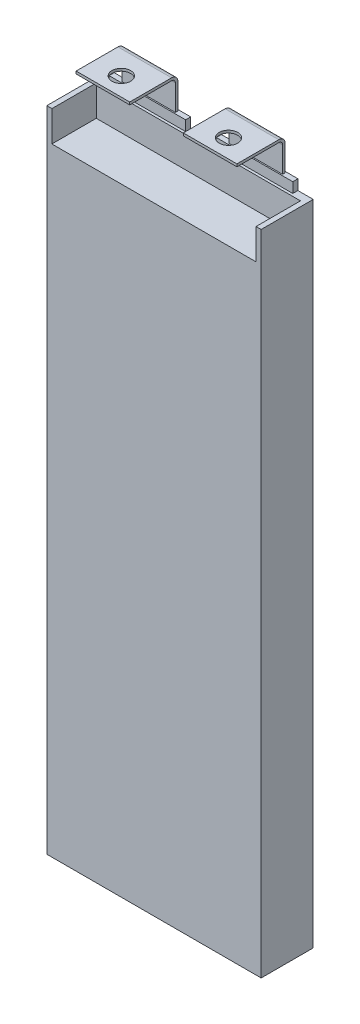
ISO-10303-21;
HEADER;
FILE_DESCRIPTION(('STEP AP214'),'2;1');
FILE_NAME('part.step','',(''),(''),'','','');
FILE_SCHEMA(('AUTOMOTIVE_DESIGN { 1 0 10303 214 1 1 1 1 }'));
ENDSEC;
DATA;
#1=APPLICATION_CONTEXT('core data for automotive mechanical design processes');
#2=APPLICATION_PROTOCOL_DEFINITION('international standard','automotive_design',2000,#1);
#3=PRODUCT_CONTEXT('',#1,'mechanical');
#4=PRODUCT('Part','Part','',(#3));
#5=PRODUCT_RELATED_PRODUCT_CATEGORY('part','',(#4));
#6=PRODUCT_DEFINITION_FORMATION('','',#4);
#7=PRODUCT_DEFINITION_CONTEXT('part definition',#1,'design');
#8=PRODUCT_DEFINITION('design','',#6,#7);
#9=PRODUCT_DEFINITION_SHAPE('','',#8);
#10=(LENGTH_UNIT() NAMED_UNIT(*) SI_UNIT(.MILLI.,.METRE.));
#11=(NAMED_UNIT(*) PLANE_ANGLE_UNIT() SI_UNIT($,.RADIAN.));
#12=(NAMED_UNIT(*) SI_UNIT($,.STERADIAN.) SOLID_ANGLE_UNIT());
#13=UNCERTAINTY_MEASURE_WITH_UNIT(LENGTH_MEASURE(1.E-05),#10,'distance_accuracy_value','');
#14=(GEOMETRIC_REPRESENTATION_CONTEXT(3) GLOBAL_UNCERTAINTY_ASSIGNED_CONTEXT((#13)) GLOBAL_UNIT_ASSIGNED_CONTEXT((#10,
#11,#12)) REPRESENTATION_CONTEXT('',''));
#15=CARTESIAN_POINT('',(0.,0.,0.));
#16=DIRECTION('',(0.,0.,1.));
#17=DIRECTION('',(1.,0.,0.));
#18=AXIS2_PLACEMENT_3D('',#15,#16,#17);
#19=CARTESIAN_POINT('',(-15.75,134.,-3.6));
#20=DIRECTION('',(1.,0.,0.));
#21=DIRECTION('',(0.,0.,-1.));
#22=AXIS2_PLACEMENT_3D('',#19,#20,#21);
#23=CYLINDRICAL_SURFACE('',#22,1.25);
#24=DIRECTION('',(1.,0.,0.));
#25=VECTOR('',#24,1.);
#26=CARTESIAN_POINT('',(-15.75,134.,-4.85));
#27=LINE('',#26,#25);
#28=CARTESIAN_POINT('',(-15.75,134.,-4.85));
#29=VERTEX_POINT('',#28);
#30=CARTESIAN_POINT('',(-5.25,134.,-4.85));
#31=VERTEX_POINT('',#30);
#32=EDGE_CURVE('E526',#29,#31,#27,.T.);
#33=ORIENTED_EDGE('',*,*,#32,.F.);
#34=CARTESIAN_POINT('',(-15.75,134.,-3.6));
#35=DIRECTION('',(-1.,0.,0.));
#36=DIRECTION('',(0.,0.,1.));
#37=AXIS2_PLACEMENT_3D('',#34,#35,#36);
#38=CIRCLE('',#37,1.25);
#39=CARTESIAN_POINT('',(-15.75,134.883883476483,-4.48388347648318));
#40=VERTEX_POINT('',#39);
#41=EDGE_CURVE('E532',#40,#29,#38,.T.);
#42=ORIENTED_EDGE('',*,*,#41,.F.);
#43=CARTESIAN_POINT('',(-15.75,134.,-3.6));
#44=DIRECTION('',(-1.,0.,0.));
#45=DIRECTION('',(0.,0.,1.));
#46=AXIS2_PLACEMENT_3D('',#43,#44,#45);
#47=CIRCLE('',#46,1.25);
#48=CARTESIAN_POINT('',(-15.75,135.25,-3.6));
#49=VERTEX_POINT('',#48);
#50=EDGE_CURVE('E61',#49,#40,#47,.T.);
#51=ORIENTED_EDGE('',*,*,#50,.F.);
#52=DIRECTION('',(1.,0.,0.));
#53=VECTOR('',#52,1.);
#54=CARTESIAN_POINT('',(-15.75,135.25,-3.6));
#55=LINE('',#54,#53);
#56=CARTESIAN_POINT('',(-5.25,135.25,-3.6));
#57=VERTEX_POINT('',#56);
#58=EDGE_CURVE('E529',#57,#49,#55,.F.);
#59=ORIENTED_EDGE('',*,*,#58,.F.);
#60=CARTESIAN_POINT('',(-5.25,134.,-3.6));
#61=DIRECTION('',(1.,0.,0.));
#62=DIRECTION('',(0.,0.,-1.));
#63=AXIS2_PLACEMENT_3D('',#60,#61,#62);
#64=CIRCLE('',#63,1.25);
#65=CARTESIAN_POINT('',(-5.25,134.883883476483,-4.48388347648318));
#66=VERTEX_POINT('',#65);
#67=EDGE_CURVE('E48',#66,#57,#64,.T.);
#68=ORIENTED_EDGE('',*,*,#67,.F.);
#69=CARTESIAN_POINT('',(-5.25,134.,-3.6));
#70=DIRECTION('',(1.,0.,0.));
#71=DIRECTION('',(0.,0.,-1.));
#72=AXIS2_PLACEMENT_3D('',#69,#70,#71);
#73=CIRCLE('',#72,1.25);
#74=EDGE_CURVE('E12',#31,#66,#73,.T.);
#75=ORIENTED_EDGE('',*,*,#74,.F.);
#76=EDGE_LOOP('',(#33,#42,#51,#59,#68,#75));
#77=FACE_BOUND('',#76,.T.);
#78=ADVANCED_FACE('F41',(#77),#23,.T.);
#79=CARTESIAN_POINT('',(-15.75,134.,-3.6));
#80=DIRECTION('',(1.,0.,0.));
#81=DIRECTION('',(0.,0.,-1.));
#82=AXIS2_PLACEMENT_3D('',#79,#80,#81);
#83=CYLINDRICAL_SURFACE('',#82,0.75);
#84=DIRECTION('',(-1.,0.,0.));
#85=VECTOR('',#84,1.);
#86=CARTESIAN_POINT('',(-15.75,134.,-4.35));
#87=LINE('',#86,#85);
#88=CARTESIAN_POINT('',(-5.25,134.,-4.35));
#89=VERTEX_POINT('',#88);
#90=CARTESIAN_POINT('',(-15.75,134.,-4.35));
#91=VERTEX_POINT('',#90);
#92=EDGE_CURVE('E516',#89,#91,#87,.T.);
#93=ORIENTED_EDGE('',*,*,#92,.F.);
#94=CARTESIAN_POINT('',(-5.25,134.,-3.6));
#95=DIRECTION('',(1.,0.,0.));
#96=DIRECTION('',(0.,0.,-1.));
#97=AXIS2_PLACEMENT_3D('',#94,#95,#96);
#98=CIRCLE('',#97,0.75);
#99=CARTESIAN_POINT('',(-5.25,134.75,-3.6));
#100=VERTEX_POINT('',#99);
#101=EDGE_CURVE('E522',#89,#100,#98,.T.);
#102=ORIENTED_EDGE('',*,*,#101,.T.);
#103=DIRECTION('',(-1.,0.,0.));
#104=VECTOR('',#103,1.);
#105=CARTESIAN_POINT('',(-15.75,134.75,-3.6));
#106=LINE('',#105,#104);
#107=CARTESIAN_POINT('',(-15.75,134.75,-3.6));
#108=VERTEX_POINT('',#107);
#109=EDGE_CURVE('E519',#108,#100,#106,.F.);
#110=ORIENTED_EDGE('',*,*,#109,.F.);
#111=CARTESIAN_POINT('',(-15.75,134.,-3.6));
#112=DIRECTION('',(-1.,0.,0.));
#113=DIRECTION('',(0.,0.,1.));
#114=AXIS2_PLACEMENT_3D('',#111,#112,#113);
#115=CIRCLE('',#114,0.75);
#116=EDGE_CURVE('E524',#108,#91,#115,.T.);
#117=ORIENTED_EDGE('',*,*,#116,.T.);
#118=EDGE_LOOP('',(#93,#102,#110,#117));
#119=FACE_BOUND('',#118,.T.);
#120=ADVANCED_FACE('F558',(#119),#83,.F.);
#121=CARTESIAN_POINT('',(5.25,134.,-3.6));
#122=DIRECTION('',(1.,0.,0.));
#123=DIRECTION('',(0.,0.,-1.));
#124=AXIS2_PLACEMENT_3D('',#121,#122,#123);
#125=CYLINDRICAL_SURFACE('',#124,1.25);
#126=DIRECTION('',(1.,0.,0.));
#127=VECTOR('',#126,1.);
#128=CARTESIAN_POINT('',(5.25,134.,-4.85));
#129=LINE('',#128,#127);
#130=CARTESIAN_POINT('',(5.25,134.,-4.85));
#131=VERTEX_POINT('',#130);
#132=CARTESIAN_POINT('',(15.75,134.,-4.85));
#133=VERTEX_POINT('',#132);
#134=EDGE_CURVE('E502',#131,#133,#129,.T.);
#135=ORIENTED_EDGE('',*,*,#134,.F.);
#136=CARTESIAN_POINT('',(5.25,134.,-3.6));
#137=DIRECTION('',(-1.,0.,0.));
#138=DIRECTION('',(0.,0.,1.));
#139=AXIS2_PLACEMENT_3D('',#136,#137,#138);
#140=CIRCLE('',#139,1.25);
#141=CARTESIAN_POINT('',(5.25,134.883883476483,-4.48388347648318));
#142=VERTEX_POINT('',#141);
#143=EDGE_CURVE('E508',#142,#131,#140,.T.);
#144=ORIENTED_EDGE('',*,*,#143,.F.);
#145=CARTESIAN_POINT('',(5.25,134.,-3.6));
#146=DIRECTION('',(-1.,0.,0.));
#147=DIRECTION('',(0.,0.,1.));
#148=AXIS2_PLACEMENT_3D('',#145,#146,#147);
#149=CIRCLE('',#148,1.25);
#150=CARTESIAN_POINT('',(5.25,135.25,-3.6));
#151=VERTEX_POINT('',#150);
#152=EDGE_CURVE('E510',#151,#142,#149,.T.);
#153=ORIENTED_EDGE('',*,*,#152,.F.);
#154=DIRECTION('',(1.,0.,0.));
#155=VECTOR('',#154,1.);
#156=CARTESIAN_POINT('',(5.25,135.25,-3.6));
#157=LINE('',#156,#155);
#158=CARTESIAN_POINT('',(15.75,135.25,-3.6));
#159=VERTEX_POINT('',#158);
#160=EDGE_CURVE('E505',#159,#151,#157,.F.);
#161=ORIENTED_EDGE('',*,*,#160,.F.);
#162=CARTESIAN_POINT('',(15.75,134.,-3.6));
#163=DIRECTION('',(1.,0.,0.));
#164=DIRECTION('',(0.,0.,-1.));
#165=AXIS2_PLACEMENT_3D('',#162,#163,#164);
#166=CIRCLE('',#165,1.25);
#167=CARTESIAN_POINT('',(15.75,134.883883476483,-4.48388347648319));
#168=VERTEX_POINT('',#167);
#169=EDGE_CURVE('E512',#168,#159,#166,.T.);
#170=ORIENTED_EDGE('',*,*,#169,.F.);
#171=CARTESIAN_POINT('',(15.75,134.,-3.6));
#172=DIRECTION('',(1.,0.,0.));
#173=DIRECTION('',(0.,0.,-1.));
#174=AXIS2_PLACEMENT_3D('',#171,#172,#173);
#175=CIRCLE('',#174,1.25);
#176=EDGE_CURVE('E514',#133,#168,#175,.T.);
#177=ORIENTED_EDGE('',*,*,#176,.F.);
#178=EDGE_LOOP('',(#135,#144,#153,#161,#170,#177));
#179=FACE_BOUND('',#178,.T.);
#180=ADVANCED_FACE('F587',(#179),#125,.T.);
#181=CARTESIAN_POINT('',(5.25,134.,-3.6));
#182=DIRECTION('',(1.,0.,0.));
#183=DIRECTION('',(0.,0.,-1.));
#184=AXIS2_PLACEMENT_3D('',#181,#182,#183);
#185=CYLINDRICAL_SURFACE('',#184,0.75);
#186=DIRECTION('',(-1.,0.,0.));
#187=VECTOR('',#186,1.);
#188=CARTESIAN_POINT('',(5.25,134.,-4.35));
#189=LINE('',#188,#187);
#190=CARTESIAN_POINT('',(15.75,134.,-4.35));
#191=VERTEX_POINT('',#190);
#192=CARTESIAN_POINT('',(5.25,134.,-4.35));
#193=VERTEX_POINT('',#192);
#194=EDGE_CURVE('E291',#191,#193,#189,.T.);
#195=ORIENTED_EDGE('',*,*,#194,.F.);
#196=CARTESIAN_POINT('',(15.75,134.,-3.6));
#197=DIRECTION('',(1.,0.,0.));
#198=DIRECTION('',(0.,0.,-1.));
#199=AXIS2_PLACEMENT_3D('',#196,#197,#198);
#200=CIRCLE('',#199,0.75);
#201=CARTESIAN_POINT('',(15.75,134.75,-3.6));
#202=VERTEX_POINT('',#201);
#203=EDGE_CURVE('E498',#191,#202,#200,.T.);
#204=ORIENTED_EDGE('',*,*,#203,.T.);
#205=DIRECTION('',(-1.,0.,0.));
#206=VECTOR('',#205,1.);
#207=CARTESIAN_POINT('',(5.25,134.75,-3.6));
#208=LINE('',#207,#206);
#209=CARTESIAN_POINT('',(5.25,134.75,-3.6));
#210=VERTEX_POINT('',#209);
#211=EDGE_CURVE('E495',#210,#202,#208,.F.);
#212=ORIENTED_EDGE('',*,*,#211,.F.);
#213=CARTESIAN_POINT('',(5.25,134.,-3.6));
#214=DIRECTION('',(-1.,0.,0.));
#215=DIRECTION('',(0.,0.,1.));
#216=AXIS2_PLACEMENT_3D('',#213,#214,#215);
#217=CIRCLE('',#216,0.75);
#218=EDGE_CURVE('E500',#210,#193,#217,.T.);
#219=ORIENTED_EDGE('',*,*,#218,.T.);
#220=EDGE_LOOP('',(#195,#204,#212,#219));
#221=FACE_BOUND('',#220,.T.);
#222=ADVANCED_FACE('F591',(#221),#185,.F.);
#223=CARTESIAN_POINT('',(-21.,127.,5.1));
#224=DIRECTION('',(0.,-1.,0.));
#225=DIRECTION('',(0.,0.,-1.));
#226=AXIS2_PLACEMENT_3D('',#223,#224,#225);
#227=PLANE('',#226);
#228=DIRECTION('',(0.,0.,1.));
#229=VECTOR('',#228,1.);
#230=CARTESIAN_POINT('',(-3.,127.,-5.1));
#231=LINE('',#230,#229);
#232=CARTESIAN_POINT('',(-3.00000000000001,127.,-5.1));
#233=VERTEX_POINT('',#232);
#234=CARTESIAN_POINT('',(-2.99999999999999,127.,-4.1));
#235=VERTEX_POINT('',#234);
#236=EDGE_CURVE('E334',#233,#235,#231,.T.);
#237=ORIENTED_EDGE('',*,*,#236,.T.);
#238=DIRECTION('',(-1.,0.,0.));
#239=VECTOR('',#238,1.);
#240=CARTESIAN_POINT('',(-3.,127.,-4.1));
#241=LINE('',#240,#239);
#242=CARTESIAN_POINT('',(-18.,127.,-4.1));
#243=VERTEX_POINT('',#242);
#244=EDGE_CURVE('E394',#235,#243,#241,.T.);
#245=ORIENTED_EDGE('',*,*,#244,.T.);
#246=DIRECTION('',(0.,0.,1.));
#247=VECTOR('',#246,1.);
#248=CARTESIAN_POINT('',(-18.,127.,-5.1));
#249=LINE('',#248,#247);
#250=CARTESIAN_POINT('',(-18.,127.,-5.1));
#251=VERTEX_POINT('',#250);
#252=EDGE_CURVE('E379',#251,#243,#249,.T.);
#253=ORIENTED_EDGE('',*,*,#252,.F.);
#254=DIRECTION('',(-1.,0.,0.));
#255=VECTOR('',#254,1.);
#256=CARTESIAN_POINT('',(-21.,127.,-5.1));
#257=LINE('',#256,#255);
#258=CARTESIAN_POINT('',(-21.,127.,-5.1));
#259=VERTEX_POINT('',#258);
#260=EDGE_CURVE('E479',#251,#259,#257,.T.);
#261=ORIENTED_EDGE('',*,*,#260,.T.);
#262=DIRECTION('',(0.,0.,-1.));
#263=VECTOR('',#262,1.);
#264=CARTESIAN_POINT('',(-21.,127.,5.1));
#265=LINE('',#264,#263);
#266=CARTESIAN_POINT('',(-21.,127.,5.1));
#267=VERTEX_POINT('',#266);
#268=EDGE_CURVE('E472',#267,#259,#265,.T.);
#269=ORIENTED_EDGE('',*,*,#268,.F.);
#270=DIRECTION('',(-1.,0.,0.));
#271=VECTOR('',#270,1.);
#272=CARTESIAN_POINT('',(-21.,127.,5.1));
#273=LINE('',#272,#271);
#274=CARTESIAN_POINT('',(-20.,127.,5.1));
#275=VERTEX_POINT('',#274);
#276=EDGE_CURVE('E468',#275,#267,#273,.T.);
#277=ORIENTED_EDGE('',*,*,#276,.F.);
#278=DIRECTION('',(0.,0.,1.));
#279=VECTOR('',#278,1.);
#280=CARTESIAN_POINT('',(-20.,127.,-45.0474968323134));
#281=LINE('',#280,#279);
#282=CARTESIAN_POINT('',(-20.,127.,-3.6));
#283=VERTEX_POINT('',#282);
#284=EDGE_CURVE('E446',#283,#275,#281,.T.);
#285=ORIENTED_EDGE('',*,*,#284,.F.);
#286=DIRECTION('',(-1.,0.,0.));
#287=VECTOR('',#286,1.);
#288=CARTESIAN_POINT('',(-20.,127.,-3.6));
#289=LINE('',#288,#287);
#290=CARTESIAN_POINT('',(20.,127.,-3.6));
#291=VERTEX_POINT('',#290);
#292=EDGE_CURVE('E447',#291,#283,#289,.T.);
#293=ORIENTED_EDGE('',*,*,#292,.F.);
#294=DIRECTION('',(0.,0.,1.));
#295=VECTOR('',#294,1.);
#296=CARTESIAN_POINT('',(20.,127.,-45.0474968323134));
#297=LINE('',#296,#295);
#298=CARTESIAN_POINT('',(20.,127.,5.1));
#299=VERTEX_POINT('',#298);
#300=EDGE_CURVE('E450',#291,#299,#297,.T.);
#301=ORIENTED_EDGE('',*,*,#300,.T.);
#302=CARTESIAN_POINT('',(21.,127.,5.1));
#303=VERTEX_POINT('',#302);
#304=EDGE_CURVE('E469',#303,#299,#273,.T.);
#305=ORIENTED_EDGE('',*,*,#304,.F.);
#306=DIRECTION('',(0.,0.,-1.));
#307=VECTOR('',#306,1.);
#308=CARTESIAN_POINT('',(21.,127.,5.1));
#309=LINE('',#308,#307);
#310=CARTESIAN_POINT('',(21.,127.,-5.1));
#311=VERTEX_POINT('',#310);
#312=EDGE_CURVE('E485',#303,#311,#309,.T.);
#313=ORIENTED_EDGE('',*,*,#312,.T.);
#314=CARTESIAN_POINT('',(18.,127.,-5.1));
#315=VERTEX_POINT('',#314);
#316=EDGE_CURVE('E464',#311,#315,#257,.T.);
#317=ORIENTED_EDGE('',*,*,#316,.T.);
#318=DIRECTION('',(0.,0.,1.));
#319=VECTOR('',#318,1.);
#320=CARTESIAN_POINT('',(18.,127.,-5.1));
#321=LINE('',#320,#319);
#322=CARTESIAN_POINT('',(18.,127.,-4.1));
#323=VERTEX_POINT('',#322);
#324=EDGE_CURVE('E427',#315,#323,#321,.T.);
#325=ORIENTED_EDGE('',*,*,#324,.T.);
#326=DIRECTION('',(-1.,0.,0.));
#327=VECTOR('',#326,1.);
#328=CARTESIAN_POINT('',(18.,127.,-4.1));
#329=LINE('',#328,#327);
#330=CARTESIAN_POINT('',(3.,127.,-4.1));
#331=VERTEX_POINT('',#330);
#332=EDGE_CURVE('E414',#323,#331,#329,.T.);
#333=ORIENTED_EDGE('',*,*,#332,.T.);
#334=DIRECTION('',(0.,0.,1.));
#335=VECTOR('',#334,1.);
#336=CARTESIAN_POINT('',(3.,127.,-5.1));
#337=LINE('',#336,#335);
#338=CARTESIAN_POINT('',(3.,127.,-5.1));
#339=VERTEX_POINT('',#338);
#340=EDGE_CURVE('E425',#339,#331,#337,.T.);
#341=ORIENTED_EDGE('',*,*,#340,.F.);
#342=EDGE_CURVE('E482',#339,#233,#257,.T.);
#343=ORIENTED_EDGE('',*,*,#342,.T.);
#344=EDGE_LOOP('',(#237,#245,#253,#261,#269,#277,#285,#293,#301,#305,#313,#317,#325,#333,#341,#343));
#345=FACE_BOUND('',#344,.T.);
#346=ADVANCED_FACE('F597',(#345),#227,.F.);
#347=CARTESIAN_POINT('',(-21.,0.,5.1));
#348=DIRECTION('',(1.,0.,0.));
#349=DIRECTION('',(0.,0.,-1.));
#350=AXIS2_PLACEMENT_3D('',#347,#348,#349);
#351=PLANE('',#350);
#352=DIRECTION('',(0.,-1.,0.));
#353=VECTOR('',#352,1.);
#354=CARTESIAN_POINT('',(-21.,0.,-5.1));
#355=LINE('',#354,#353);
#356=CARTESIAN_POINT('',(-21.,0.,-5.1));
#357=VERTEX_POINT('',#356);
#358=EDGE_CURVE('E459',#259,#357,#355,.T.);
#359=ORIENTED_EDGE('',*,*,#358,.T.);
#360=DIRECTION('',(0.,0.,-1.));
#361=VECTOR('',#360,1.);
#362=CARTESIAN_POINT('',(-21.,0.,5.1));
#363=LINE('',#362,#361);
#364=CARTESIAN_POINT('',(-21.,0.,5.1));
#365=VERTEX_POINT('',#364);
#366=EDGE_CURVE('E491',#365,#357,#363,.T.);
#367=ORIENTED_EDGE('',*,*,#366,.F.);
#368=DIRECTION('',(0.,-1.,0.));
#369=VECTOR('',#368,1.);
#370=CARTESIAN_POINT('',(-21.,0.,5.1));
#371=LINE('',#370,#369);
#372=EDGE_CURVE('E460',#267,#365,#371,.T.);
#373=ORIENTED_EDGE('',*,*,#372,.F.);
#374=ORIENTED_EDGE('',*,*,#268,.T.);
#375=EDGE_LOOP('',(#359,#367,#373,#374));
#376=FACE_BOUND('',#375,.T.);
#377=ADVANCED_FACE('F599',(#376),#351,.F.);
#378=CARTESIAN_POINT('',(-21.,0.,5.1));
#379=DIRECTION('',(0.,1.,0.));
#380=DIRECTION('',(0.,0.,1.));
#381=AXIS2_PLACEMENT_3D('',#378,#379,#380);
#382=PLANE('',#381);
#383=DIRECTION('',(1.,0.,0.));
#384=VECTOR('',#383,1.);
#385=CARTESIAN_POINT('',(-21.,0.,-5.1));
#386=LINE('',#385,#384);
#387=CARTESIAN_POINT('',(21.,0.,-5.1));
#388=VERTEX_POINT('',#387);
#389=EDGE_CURVE('E475',#357,#388,#386,.T.);
#390=ORIENTED_EDGE('',*,*,#389,.T.);
#391=DIRECTION('',(0.,0.,-1.));
#392=VECTOR('',#391,1.);
#393=CARTESIAN_POINT('',(21.,0.,5.1));
#394=LINE('',#393,#392);
#395=CARTESIAN_POINT('',(21.,0.,5.1));
#396=VERTEX_POINT('',#395);
#397=EDGE_CURVE('E488',#396,#388,#394,.T.);
#398=ORIENTED_EDGE('',*,*,#397,.F.);
#399=DIRECTION('',(1.,0.,0.));
#400=VECTOR('',#399,1.);
#401=CARTESIAN_POINT('',(-21.,0.,5.1));
#402=LINE('',#401,#400);
#403=EDGE_CURVE('E463',#365,#396,#402,.T.);
#404=ORIENTED_EDGE('',*,*,#403,.F.);
#405=ORIENTED_EDGE('',*,*,#366,.T.);
#406=EDGE_LOOP('',(#390,#398,#404,#405));
#407=FACE_BOUND('',#406,.T.);
#408=ADVANCED_FACE('F602',(#407),#382,.F.);
#409=CARTESIAN_POINT('',(21.,0.,5.1));
#410=DIRECTION('',(-1.,0.,0.));
#411=DIRECTION('',(0.,0.,1.));
#412=AXIS2_PLACEMENT_3D('',#409,#410,#411);
#413=PLANE('',#412);
#414=DIRECTION('',(0.,1.,0.));
#415=VECTOR('',#414,1.);
#416=CARTESIAN_POINT('',(21.,0.,-5.1));
#417=LINE('',#416,#415);
#418=EDGE_CURVE('E477',#388,#311,#417,.T.);
#419=ORIENTED_EDGE('',*,*,#418,.T.);
#420=ORIENTED_EDGE('',*,*,#312,.F.);
#421=DIRECTION('',(0.,1.,0.));
#422=VECTOR('',#421,1.);
#423=CARTESIAN_POINT('',(21.,0.,5.1));
#424=LINE('',#423,#422);
#425=EDGE_CURVE('E466',#396,#303,#424,.T.);
#426=ORIENTED_EDGE('',*,*,#425,.F.);
#427=ORIENTED_EDGE('',*,*,#397,.T.);
#428=EDGE_LOOP('',(#419,#420,#426,#427));
#429=FACE_BOUND('',#428,.T.);
#430=ADVANCED_FACE('F606',(#429),#413,.F.);
#431=CARTESIAN_POINT('',(0.,0.,5.1));
#432=DIRECTION('',(0.,0.,-1.));
#433=DIRECTION('',(-1.,0.,0.));
#434=AXIS2_PLACEMENT_3D('',#431,#432,#433);
#435=PLANE('',#434);
#436=ORIENTED_EDGE('',*,*,#304,.T.);
#437=DIRECTION('',(0.,1.,0.));
#438=VECTOR('',#437,1.);
#439=CARTESIAN_POINT('',(20.,127.,5.1));
#440=LINE('',#439,#438);
#441=CARTESIAN_POINT('',(20.,121.,5.1));
#442=VERTEX_POINT('',#441);
#443=EDGE_CURVE('E431',#442,#299,#440,.T.);
#444=ORIENTED_EDGE('',*,*,#443,.F.);
#445=DIRECTION('',(1.,0.,0.));
#446=VECTOR('',#445,1.);
#447=CARTESIAN_POINT('',(-20.,121.,5.1));
#448=LINE('',#447,#446);
#449=CARTESIAN_POINT('',(-20.,121.,5.1));
#450=VERTEX_POINT('',#449);
#451=EDGE_CURVE('E434',#450,#442,#448,.T.);
#452=ORIENTED_EDGE('',*,*,#451,.F.);
#453=DIRECTION('',(0.,-1.,0.));
#454=VECTOR('',#453,1.);
#455=CARTESIAN_POINT('',(-20.,127.,5.1));
#456=LINE('',#455,#454);
#457=EDGE_CURVE('E430',#275,#450,#456,.T.);
#458=ORIENTED_EDGE('',*,*,#457,.F.);
#459=ORIENTED_EDGE('',*,*,#276,.T.);
#460=ORIENTED_EDGE('',*,*,#372,.T.);
#461=ORIENTED_EDGE('',*,*,#403,.T.);
#462=ORIENTED_EDGE('',*,*,#425,.T.);
#463=EDGE_LOOP('',(#436,#444,#452,#458,#459,#460,#461,#462));
#464=FACE_BOUND('',#463,.T.);
#465=ADVANCED_FACE('F610',(#464),#435,.F.);
#466=CARTESIAN_POINT('',(0.,0.,-5.1));
#467=DIRECTION('',(0.,0.,-1.));
#468=DIRECTION('',(-1.,0.,0.));
#469=AXIS2_PLACEMENT_3D('',#466,#467,#468);
#470=PLANE('',#469);
#471=ORIENTED_EDGE('',*,*,#358,.F.);
#472=ORIENTED_EDGE('',*,*,#260,.F.);
#473=DIRECTION('',(0.,1.,0.));
#474=VECTOR('',#473,1.);
#475=CARTESIAN_POINT('',(-18.,127.,-5.1));
#476=LINE('',#475,#474);
#477=CARTESIAN_POINT('',(-18.,129.,-5.1));
#478=VERTEX_POINT('',#477);
#479=EDGE_CURVE('E401',#251,#478,#476,.T.);
#480=ORIENTED_EDGE('',*,*,#479,.T.);
#481=DIRECTION('',(1.,0.,0.));
#482=VECTOR('',#481,1.);
#483=CARTESIAN_POINT('',(-2.99999999999999,129.,-5.1));
#484=LINE('',#483,#482);
#485=CARTESIAN_POINT('',(-2.99999999999999,129.,-5.1));
#486=VERTEX_POINT('',#485);
#487=EDGE_CURVE('E388',#478,#486,#484,.T.);
#488=ORIENTED_EDGE('',*,*,#487,.T.);
#489=DIRECTION('',(0.,-1.,0.));
#490=VECTOR('',#489,1.);
#491=CARTESIAN_POINT('',(-3.,127.,-5.1));
#492=LINE('',#491,#490);
#493=EDGE_CURVE('E392',#486,#233,#492,.T.);
#494=ORIENTED_EDGE('',*,*,#493,.T.);
#495=ORIENTED_EDGE('',*,*,#342,.F.);
#496=DIRECTION('',(0.,1.,0.));
#497=VECTOR('',#496,1.);
#498=CARTESIAN_POINT('',(3.,127.,-5.1));
#499=LINE('',#498,#497);
#500=CARTESIAN_POINT('',(2.99999999999999,129.,-5.1));
#501=VERTEX_POINT('',#500);
#502=EDGE_CURVE('E407',#339,#501,#499,.T.);
#503=ORIENTED_EDGE('',*,*,#502,.T.);
#504=DIRECTION('',(1.,0.,0.));
#505=VECTOR('',#504,1.);
#506=CARTESIAN_POINT('',(18.,129.,-5.1));
#507=LINE('',#506,#505);
#508=CARTESIAN_POINT('',(18.,129.,-5.1));
#509=VERTEX_POINT('',#508);
#510=EDGE_CURVE('E410',#501,#509,#507,.T.);
#511=ORIENTED_EDGE('',*,*,#510,.T.);
#512=DIRECTION('',(0.,-1.,0.));
#513=VECTOR('',#512,1.);
#514=CARTESIAN_POINT('',(18.,127.,-5.1));
#515=LINE('',#514,#513);
#516=EDGE_CURVE('E405',#509,#315,#515,.T.);
#517=ORIENTED_EDGE('',*,*,#516,.T.);
#518=ORIENTED_EDGE('',*,*,#316,.F.);
#519=ORIENTED_EDGE('',*,*,#418,.F.);
#520=ORIENTED_EDGE('',*,*,#389,.F.);
#521=EDGE_LOOP('',(#471,#472,#480,#488,#494,#495,#503,#511,#517,#518,#519,#520));
#522=FACE_BOUND('',#521,.T.);
#523=ADVANCED_FACE('F615',(#522),#470,.T.);
#524=CARTESIAN_POINT('',(0.,0.,-3.6));
#525=DIRECTION('',(0.,0.,-1.));
#526=DIRECTION('',(-1.,0.,0.));
#527=AXIS2_PLACEMENT_3D('',#524,#525,#526);
#528=PLANE('',#527);
#529=DIRECTION('',(0.,-1.,0.));
#530=VECTOR('',#529,1.);
#531=CARTESIAN_POINT('',(-20.,127.,-3.6));
#532=LINE('',#531,#530);
#533=CARTESIAN_POINT('',(-20.,121.,-3.6));
#534=VERTEX_POINT('',#533);
#535=EDGE_CURVE('E442',#283,#534,#532,.T.);
#536=ORIENTED_EDGE('',*,*,#535,.T.);
#537=DIRECTION('',(1.,0.,0.));
#538=VECTOR('',#537,1.);
#539=CARTESIAN_POINT('',(-20.,121.,-3.6));
#540=LINE('',#539,#538);
#541=CARTESIAN_POINT('',(20.,121.,-3.6));
#542=VERTEX_POINT('',#541);
#543=EDGE_CURVE('E433',#534,#542,#540,.T.);
#544=ORIENTED_EDGE('',*,*,#543,.T.);
#545=DIRECTION('',(0.,1.,0.));
#546=VECTOR('',#545,1.);
#547=CARTESIAN_POINT('',(20.,127.,-3.6));
#548=LINE('',#547,#546);
#549=EDGE_CURVE('E451',#542,#291,#548,.T.);
#550=ORIENTED_EDGE('',*,*,#549,.T.);
#551=ORIENTED_EDGE('',*,*,#292,.T.);
#552=EDGE_LOOP('',(#536,#544,#550,#551));
#553=FACE_BOUND('',#552,.T.);
#554=ADVANCED_FACE('F618',(#553),#528,.F.);
#555=CARTESIAN_POINT('',(-20.,121.,-45.0474968323134));
#556=DIRECTION('',(0.,-1.,0.));
#557=DIRECTION('',(0.,0.,-1.));
#558=AXIS2_PLACEMENT_3D('',#555,#556,#557);
#559=PLANE('',#558);
#560=DIRECTION('',(0.,0.,1.));
#561=VECTOR('',#560,1.);
#562=CARTESIAN_POINT('',(-20.,121.,-45.0474968323134));
#563=LINE('',#562,#561);
#564=EDGE_CURVE('E445',#534,#450,#563,.T.);
#565=ORIENTED_EDGE('',*,*,#564,.T.);
#566=ORIENTED_EDGE('',*,*,#451,.T.);
#567=DIRECTION('',(0.,0.,1.));
#568=VECTOR('',#567,1.);
#569=CARTESIAN_POINT('',(20.,121.,-45.0474968323134));
#570=LINE('',#569,#568);
#571=EDGE_CURVE('E441',#542,#442,#570,.T.);
#572=ORIENTED_EDGE('',*,*,#571,.F.);
#573=ORIENTED_EDGE('',*,*,#543,.F.);
#574=EDGE_LOOP('',(#565,#566,#572,#573));
#575=FACE_BOUND('',#574,.T.);
#576=ADVANCED_FACE('F625',(#575),#559,.F.);
#577=CARTESIAN_POINT('',(20.,127.,-45.0474968323134));
#578=DIRECTION('',(1.,0.,0.));
#579=DIRECTION('',(0.,0.,-1.));
#580=AXIS2_PLACEMENT_3D('',#577,#578,#579);
#581=PLANE('',#580);
#582=ORIENTED_EDGE('',*,*,#571,.T.);
#583=ORIENTED_EDGE('',*,*,#443,.T.);
#584=ORIENTED_EDGE('',*,*,#300,.F.);
#585=ORIENTED_EDGE('',*,*,#549,.F.);
#586=EDGE_LOOP('',(#582,#583,#584,#585));
#587=FACE_BOUND('',#586,.T.);
#588=ADVANCED_FACE('F629',(#587),#581,.F.);
#589=CARTESIAN_POINT('',(-20.,127.,-45.0474968323134));
#590=DIRECTION('',(-1.,0.,0.));
#591=DIRECTION('',(0.,-1.,0.));
#592=AXIS2_PLACEMENT_3D('',#589,#590,#591);
#593=PLANE('',#592);
#594=ORIENTED_EDGE('',*,*,#284,.T.);
#595=ORIENTED_EDGE('',*,*,#457,.T.);
#596=ORIENTED_EDGE('',*,*,#564,.F.);
#597=ORIENTED_EDGE('',*,*,#535,.F.);
#598=EDGE_LOOP('',(#594,#595,#596,#597));
#599=FACE_BOUND('',#598,.T.);
#600=ADVANCED_FACE('F633',(#599),#593,.F.);
#601=CARTESIAN_POINT('',(18.,127.,-5.1));
#602=DIRECTION('',(-1.,0.,0.));
#603=DIRECTION('',(0.,-1.,0.));
#604=AXIS2_PLACEMENT_3D('',#601,#602,#603);
#605=PLANE('',#604);
#606=DIRECTION('',(0.,-1.,0.));
#607=VECTOR('',#606,1.);
#608=CARTESIAN_POINT('',(18.,127.,-4.1));
#609=LINE('',#608,#607);
#610=CARTESIAN_POINT('',(18.,129.,-4.1));
#611=VERTEX_POINT('',#610);
#612=EDGE_CURVE('E399',#611,#323,#609,.T.);
#613=ORIENTED_EDGE('',*,*,#612,.T.);
#614=ORIENTED_EDGE('',*,*,#324,.F.);
#615=ORIENTED_EDGE('',*,*,#516,.F.);
#616=DIRECTION('',(0.,0.,1.));
#617=VECTOR('',#616,1.);
#618=CARTESIAN_POINT('',(18.,129.,-5.1));
#619=LINE('',#618,#617);
#620=EDGE_CURVE('E412',#509,#611,#619,.T.);
#621=ORIENTED_EDGE('',*,*,#620,.T.);
#622=EDGE_LOOP('',(#613,#614,#615,#621));
#623=FACE_BOUND('',#622,.T.);
#624=ADVANCED_FACE('F637',(#623),#605,.F.);
#625=CARTESIAN_POINT('',(3.,127.,-5.1));
#626=DIRECTION('',(1.,0.,0.));
#627=DIRECTION('',(0.,1.,0.));
#628=AXIS2_PLACEMENT_3D('',#625,#626,#627);
#629=PLANE('',#628);
#630=DIRECTION('',(0.,1.,0.));
#631=VECTOR('',#630,1.);
#632=CARTESIAN_POINT('',(3.,127.,-4.1));
#633=LINE('',#632,#631);
#634=CARTESIAN_POINT('',(2.99999999999999,129.,-4.1));
#635=VERTEX_POINT('',#634);
#636=EDGE_CURVE('E417',#331,#635,#633,.T.);
#637=ORIENTED_EDGE('',*,*,#636,.T.);
#638=DIRECTION('',(0.,0.,1.));
#639=VECTOR('',#638,1.);
#640=CARTESIAN_POINT('',(2.99999999999999,129.,-5.1));
#641=LINE('',#640,#639);
#642=EDGE_CURVE('E422',#501,#635,#641,.T.);
#643=ORIENTED_EDGE('',*,*,#642,.F.);
#644=ORIENTED_EDGE('',*,*,#502,.F.);
#645=ORIENTED_EDGE('',*,*,#340,.T.);
#646=EDGE_LOOP('',(#637,#643,#644,#645));
#647=FACE_BOUND('',#646,.T.);
#648=ADVANCED_FACE('F641',(#647),#629,.F.);
#649=CARTESIAN_POINT('',(18.,129.,-5.1));
#650=DIRECTION('',(0.,-1.,0.));
#651=DIRECTION('',(0.,0.,-1.));
#652=AXIS2_PLACEMENT_3D('',#649,#650,#651);
#653=PLANE('',#652);
#654=DIRECTION('',(0.,0.,1.));
#655=VECTOR('',#654,1.);
#656=CARTESIAN_POINT('',(5.25,129.,-4.85));
#657=LINE('',#656,#655);
#658=CARTESIAN_POINT('',(5.25,129.,-4.85));
#659=VERTEX_POINT('',#658);
#660=CARTESIAN_POINT('',(5.25,129.,-4.35));
#661=VERTEX_POINT('',#660);
#662=EDGE_CURVE('E271',#659,#661,#657,.T.);
#663=ORIENTED_EDGE('',*,*,#662,.F.);
#664=DIRECTION('',(-1.,0.,0.));
#665=VECTOR('',#664,1.);
#666=CARTESIAN_POINT('',(5.25,129.,-4.85));
#667=LINE('',#666,#665);
#668=CARTESIAN_POINT('',(15.75,129.,-4.85));
#669=VERTEX_POINT('',#668);
#670=EDGE_CURVE('E299',#669,#659,#667,.T.);
#671=ORIENTED_EDGE('',*,*,#670,.F.);
#672=DIRECTION('',(0.,0.,-1.));
#673=VECTOR('',#672,1.);
#674=CARTESIAN_POINT('',(15.75,129.,-4.85));
#675=LINE('',#674,#673);
#676=CARTESIAN_POINT('',(15.75,129.,-4.35));
#677=VERTEX_POINT('',#676);
#678=EDGE_CURVE('E297',#677,#669,#675,.T.);
#679=ORIENTED_EDGE('',*,*,#678,.F.);
#680=DIRECTION('',(1.,0.,0.));
#681=VECTOR('',#680,1.);
#682=CARTESIAN_POINT('',(5.25,129.,-4.35));
#683=LINE('',#682,#681);
#684=EDGE_CURVE('E282',#661,#677,#683,.T.);
#685=ORIENTED_EDGE('',*,*,#684,.F.);
#686=EDGE_LOOP('',(#663,#671,#679,#685));
#687=FACE_BOUND('',#686,.T.);
#688=DIRECTION('',(1.,0.,0.));
#689=VECTOR('',#688,1.);
#690=CARTESIAN_POINT('',(18.,129.,-4.1));
#691=LINE('',#690,#689);
#692=EDGE_CURVE('E408',#635,#611,#691,.T.);
#693=ORIENTED_EDGE('',*,*,#692,.T.);
#694=ORIENTED_EDGE('',*,*,#620,.F.);
#695=ORIENTED_EDGE('',*,*,#510,.F.);
#696=ORIENTED_EDGE('',*,*,#642,.T.);
#697=EDGE_LOOP('',(#693,#694,#695,#696));
#698=FACE_BOUND('',#697,.T.);
#699=ADVANCED_FACE('F295',(#687,#698),#653,.F.);
#700=CARTESIAN_POINT('',(0.,0.,-4.1));
#701=DIRECTION('',(0.,0.,1.));
#702=DIRECTION('',(1.,0.,0.));
#703=AXIS2_PLACEMENT_3D('',#700,#701,#702);
#704=PLANE('',#703);
#705=ORIENTED_EDGE('',*,*,#612,.F.);
#706=ORIENTED_EDGE('',*,*,#692,.F.);
#707=ORIENTED_EDGE('',*,*,#636,.F.);
#708=ORIENTED_EDGE('',*,*,#332,.F.);
#709=EDGE_LOOP('',(#705,#706,#707,#708));
#710=FACE_BOUND('',#709,.T.);
#711=ADVANCED_FACE('F648',(#710),#704,.T.);
#712=CARTESIAN_POINT('',(-3.,127.,-5.1));
#713=DIRECTION('',(-1.,0.,0.));
#714=DIRECTION('',(0.,-1.,0.));
#715=AXIS2_PLACEMENT_3D('',#712,#713,#714);
#716=PLANE('',#715);
#717=DIRECTION('',(0.,-1.,0.));
#718=VECTOR('',#717,1.);
#719=CARTESIAN_POINT('',(-3.,127.,-4.1));
#720=LINE('',#719,#718);
#721=CARTESIAN_POINT('',(-2.99999999999999,129.,-4.1));
#722=VERTEX_POINT('',#721);
#723=EDGE_CURVE('E396',#722,#235,#720,.T.);
#724=ORIENTED_EDGE('',*,*,#723,.T.);
#725=ORIENTED_EDGE('',*,*,#236,.F.);
#726=ORIENTED_EDGE('',*,*,#493,.F.);
#727=DIRECTION('',(0.,0.,1.));
#728=VECTOR('',#727,1.);
#729=CARTESIAN_POINT('',(-2.99999999999999,129.,-5.1));
#730=LINE('',#729,#728);
#731=EDGE_CURVE('E385',#486,#722,#730,.T.);
#732=ORIENTED_EDGE('',*,*,#731,.T.);
#733=EDGE_LOOP('',(#724,#725,#726,#732));
#734=FACE_BOUND('',#733,.T.);
#735=ADVANCED_FACE('F651',(#734),#716,.F.);
#736=CARTESIAN_POINT('',(-18.,127.,-5.1));
#737=DIRECTION('',(1.,0.,0.));
#738=DIRECTION('',(0.,1.,0.));
#739=AXIS2_PLACEMENT_3D('',#736,#737,#738);
#740=PLANE('',#739);
#741=DIRECTION('',(0.,1.,0.));
#742=VECTOR('',#741,1.);
#743=CARTESIAN_POINT('',(-18.,127.,-4.1));
#744=LINE('',#743,#742);
#745=CARTESIAN_POINT('',(-18.,129.,-4.1));
#746=VERTEX_POINT('',#745);
#747=EDGE_CURVE('E391',#243,#746,#744,.T.);
#748=ORIENTED_EDGE('',*,*,#747,.T.);
#749=DIRECTION('',(0.,0.,1.));
#750=VECTOR('',#749,1.);
#751=CARTESIAN_POINT('',(-18.,129.,-5.1));
#752=LINE('',#751,#750);
#753=EDGE_CURVE('E382',#478,#746,#752,.T.);
#754=ORIENTED_EDGE('',*,*,#753,.F.);
#755=ORIENTED_EDGE('',*,*,#479,.F.);
#756=ORIENTED_EDGE('',*,*,#252,.T.);
#757=EDGE_LOOP('',(#748,#754,#755,#756));
#758=FACE_BOUND('',#757,.T.);
#759=ADVANCED_FACE('F658',(#758),#740,.F.);
#760=CARTESIAN_POINT('',(-2.99999999999999,129.,-5.1));
#761=DIRECTION('',(0.,-1.,0.));
#762=DIRECTION('',(0.,0.,-1.));
#763=AXIS2_PLACEMENT_3D('',#760,#761,#762);
#764=PLANE('',#763);
#765=DIRECTION('',(0.,0.,1.));
#766=VECTOR('',#765,1.);
#767=CARTESIAN_POINT('',(-15.75,129.,-4.85));
#768=LINE('',#767,#766);
#769=CARTESIAN_POINT('',(-15.75,129.,-4.85));
#770=VERTEX_POINT('',#769);
#771=CARTESIAN_POINT('',(-15.75,129.,-4.35));
#772=VERTEX_POINT('',#771);
#773=EDGE_CURVE('E336',#770,#772,#768,.T.);
#774=ORIENTED_EDGE('',*,*,#773,.F.);
#775=DIRECTION('',(-1.,0.,0.));
#776=VECTOR('',#775,1.);
#777=CARTESIAN_POINT('',(-15.75,129.,-4.85));
#778=LINE('',#777,#776);
#779=CARTESIAN_POINT('',(-5.25,129.,-4.85));
#780=VERTEX_POINT('',#779);
#781=EDGE_CURVE('E347',#780,#770,#778,.T.);
#782=ORIENTED_EDGE('',*,*,#781,.F.);
#783=DIRECTION('',(0.,0.,-1.));
#784=VECTOR('',#783,1.);
#785=CARTESIAN_POINT('',(-5.25,129.,-4.85));
#786=LINE('',#785,#784);
#787=CARTESIAN_POINT('',(-5.25,129.,-4.35));
#788=VERTEX_POINT('',#787);
#789=EDGE_CURVE('E349',#788,#780,#786,.T.);
#790=ORIENTED_EDGE('',*,*,#789,.F.);
#791=DIRECTION('',(1.,0.,0.));
#792=VECTOR('',#791,1.);
#793=CARTESIAN_POINT('',(-15.75,129.,-4.35));
#794=LINE('',#793,#792);
#795=EDGE_CURVE('E338',#772,#788,#794,.T.);
#796=ORIENTED_EDGE('',*,*,#795,.F.);
#797=EDGE_LOOP('',(#774,#782,#790,#796));
#798=FACE_BOUND('',#797,.T.);
#799=DIRECTION('',(1.,0.,0.));
#800=VECTOR('',#799,1.);
#801=CARTESIAN_POINT('',(-2.99999999999999,129.,-4.1));
#802=LINE('',#801,#800);
#803=EDGE_CURVE('E389',#746,#722,#802,.T.);
#804=ORIENTED_EDGE('',*,*,#803,.T.);
#805=ORIENTED_EDGE('',*,*,#731,.F.);
#806=ORIENTED_EDGE('',*,*,#487,.F.);
#807=ORIENTED_EDGE('',*,*,#753,.T.);
#808=EDGE_LOOP('',(#804,#805,#806,#807));
#809=FACE_BOUND('',#808,.T.);
#810=ADVANCED_FACE('F565',(#798,#809),#764,.F.);
#811=CARTESIAN_POINT('',(0.,0.,-4.1));
#812=DIRECTION('',(0.,0.,1.));
#813=DIRECTION('',(1.,0.,0.));
#814=AXIS2_PLACEMENT_3D('',#811,#812,#813);
#815=PLANE('',#814);
#816=ORIENTED_EDGE('',*,*,#723,.F.);
#817=ORIENTED_EDGE('',*,*,#803,.F.);
#818=ORIENTED_EDGE('',*,*,#747,.F.);
#819=ORIENTED_EDGE('',*,*,#244,.F.);
#820=EDGE_LOOP('',(#816,#817,#818,#819));
#821=FACE_BOUND('',#820,.T.);
#822=ADVANCED_FACE('F579',(#821),#815,.T.);
#823=CARTESIAN_POINT('',(0.,130.4,4.59999999999999));
#824=DIRECTION('',(0.,0.,1.));
#825=DIRECTION('',(0.,-1.,0.));
#826=AXIS2_PLACEMENT_3D('',#823,#824,#825);
#827=PLANE('',#826);
#828=DIRECTION('',(0.,-1.,0.));
#829=VECTOR('',#828,1.);
#830=CARTESIAN_POINT('',(-15.75,135.25,4.59999999999999));
#831=LINE('',#830,#829);
#832=CARTESIAN_POINT('',(-15.75,135.25,4.59999999999999));
#833=VERTEX_POINT('',#832);
#834=CARTESIAN_POINT('',(-15.75,134.75,4.59999999999999));
#835=VERTEX_POINT('',#834);
#836=EDGE_CURVE('E368',#833,#835,#831,.T.);
#837=ORIENTED_EDGE('',*,*,#836,.T.);
#838=DIRECTION('',(1.,0.,0.));
#839=VECTOR('',#838,1.);
#840=CARTESIAN_POINT('',(-15.75,134.75,4.59999999999999));
#841=LINE('',#840,#839);
#842=CARTESIAN_POINT('',(-5.25,134.75,4.59999999999999));
#843=VERTEX_POINT('',#842);
#844=EDGE_CURVE('E365',#835,#843,#841,.T.);
#845=ORIENTED_EDGE('',*,*,#844,.T.);
#846=DIRECTION('',(0.,1.,0.));
#847=VECTOR('',#846,1.);
#848=CARTESIAN_POINT('',(-5.25,135.25,4.59999999999999));
#849=LINE('',#848,#847);
#850=CARTESIAN_POINT('',(-5.25,135.25,4.59999999999999));
#851=VERTEX_POINT('',#850);
#852=EDGE_CURVE('E362',#843,#851,#849,.T.);
#853=ORIENTED_EDGE('',*,*,#852,.T.);
#854=DIRECTION('',(-1.,0.,0.));
#855=VECTOR('',#854,1.);
#856=CARTESIAN_POINT('',(-15.75,135.25,4.59999999999999));
#857=LINE('',#856,#855);
#858=EDGE_CURVE('E359',#851,#833,#857,.T.);
#859=ORIENTED_EDGE('',*,*,#858,.T.);
#860=EDGE_LOOP('',(#837,#845,#853,#859));
#861=FACE_BOUND('',#860,.T.);
#862=ADVANCED_FACE('F546',(#861),#827,.T.);
#863=CARTESIAN_POINT('',(-15.75,135.25,-4.97499999999998));
#864=DIRECTION('',(-1.,0.,0.));
#865=DIRECTION('',(0.,0.,1.));
#866=AXIS2_PLACEMENT_3D('',#863,#864,#865);
#867=PLANE('',#866);
#868=ORIENTED_EDGE('',*,*,#41,.T.);
#869=DIRECTION('',(0.,1.,0.));
#870=VECTOR('',#869,1.);
#871=CARTESIAN_POINT('',(-15.75,129.,-4.85));
#872=LINE('',#871,#870);
#873=EDGE_CURVE('E344',#770,#29,#872,.T.);
#874=ORIENTED_EDGE('',*,*,#873,.F.);
#875=ORIENTED_EDGE('',*,*,#773,.T.);
#876=DIRECTION('',(0.,1.,0.));
#877=VECTOR('',#876,1.);
#878=CARTESIAN_POINT('',(-15.75,129.,-4.35));
#879=LINE('',#878,#877);
#880=EDGE_CURVE('E340',#772,#91,#879,.T.);
#881=ORIENTED_EDGE('',*,*,#880,.T.);
#882=ORIENTED_EDGE('',*,*,#116,.F.);
#883=DIRECTION('',(0.,0.,1.));
#884=VECTOR('',#883,1.);
#885=CARTESIAN_POINT('',(-15.75,134.75,-4.97499999999998));
#886=LINE('',#885,#884);
#887=EDGE_CURVE('E375',#108,#835,#886,.T.);
#888=ORIENTED_EDGE('',*,*,#887,.T.);
#889=ORIENTED_EDGE('',*,*,#836,.F.);
#890=DIRECTION('',(0.,0.,1.));
#891=VECTOR('',#890,1.);
#892=CARTESIAN_POINT('',(-15.75,135.25,-4.97499999999998));
#893=LINE('',#892,#891);
#894=EDGE_CURVE('E339',#49,#833,#893,.T.);
#895=ORIENTED_EDGE('',*,*,#894,.F.);
#896=ORIENTED_EDGE('',*,*,#50,.T.);
#897=EDGE_LOOP('',(#868,#874,#875,#881,#882,#888,#889,#895,#896));
#898=FACE_BOUND('',#897,.T.);
#899=ADVANCED_FACE('F548',(#898),#867,.T.);
#900=CARTESIAN_POINT('',(-15.75,134.75,-4.97499999999998));
#901=DIRECTION('',(0.,-1.,0.));
#902=DIRECTION('',(0.,0.,-1.));
#903=AXIS2_PLACEMENT_3D('',#900,#901,#902);
#904=PLANE('',#903);
#905=CARTESIAN_POINT('',(-10.5,134.75,0.999999999999997));
#906=DIRECTION('',(0.,-1.,0.));
#907=DIRECTION('',(0.,0.,-1.));
#908=AXIS2_PLACEMENT_3D('',#905,#906,#907);
#909=CIRCLE('',#908,1.8288);
#910=CARTESIAN_POINT('',(-10.5,134.75,-0.828800000000003));
#911=VERTEX_POINT('',#910);
#912=EDGE_CURVE('E316',#911,#911,#909,.T.);
#913=ORIENTED_EDGE('',*,*,#912,.F.);
#914=EDGE_LOOP('',(#913));
#915=FACE_BOUND('',#914,.T.);
#916=ORIENTED_EDGE('',*,*,#887,.F.);
#917=ORIENTED_EDGE('',*,*,#109,.T.);
#918=DIRECTION('',(0.,0.,1.));
#919=VECTOR('',#918,1.);
#920=CARTESIAN_POINT('',(-5.25,134.75,-4.97499999999998));
#921=LINE('',#920,#919);
#922=EDGE_CURVE('E373',#100,#843,#921,.T.);
#923=ORIENTED_EDGE('',*,*,#922,.T.);
#924=ORIENTED_EDGE('',*,*,#844,.F.);
#925=EDGE_LOOP('',(#916,#917,#923,#924));
#926=FACE_BOUND('',#925,.T.);
#927=ADVANCED_FACE('F552',(#915,#926),#904,.T.);
#928=CARTESIAN_POINT('',(-5.25,135.25,-4.97499999999998));
#929=DIRECTION('',(1.,0.,0.));
#930=DIRECTION('',(0.,0.,-1.));
#931=AXIS2_PLACEMENT_3D('',#928,#929,#930);
#932=PLANE('',#931);
#933=ORIENTED_EDGE('',*,*,#67,.T.);
#934=DIRECTION('',(0.,0.,1.));
#935=VECTOR('',#934,1.);
#936=CARTESIAN_POINT('',(-5.25,135.25,-4.97499999999998));
#937=LINE('',#936,#935);
#938=EDGE_CURVE('E371',#57,#851,#937,.T.);
#939=ORIENTED_EDGE('',*,*,#938,.T.);
#940=ORIENTED_EDGE('',*,*,#852,.F.);
#941=ORIENTED_EDGE('',*,*,#922,.F.);
#942=ORIENTED_EDGE('',*,*,#101,.F.);
#943=DIRECTION('',(0.,1.,0.));
#944=VECTOR('',#943,1.);
#945=CARTESIAN_POINT('',(-5.25,129.,-4.35));
#946=LINE('',#945,#944);
#947=EDGE_CURVE('E343',#788,#89,#946,.T.);
#948=ORIENTED_EDGE('',*,*,#947,.F.);
#949=ORIENTED_EDGE('',*,*,#789,.T.);
#950=DIRECTION('',(0.,1.,0.));
#951=VECTOR('',#950,1.);
#952=CARTESIAN_POINT('',(-5.25,129.,-4.85));
#953=LINE('',#952,#951);
#954=EDGE_CURVE('E352',#780,#31,#953,.T.);
#955=ORIENTED_EDGE('',*,*,#954,.T.);
#956=ORIENTED_EDGE('',*,*,#74,.T.);
#957=EDGE_LOOP('',(#933,#939,#940,#941,#942,#948,#949,#955,#956));
#958=FACE_BOUND('',#957,.T.);
#959=ADVANCED_FACE('F536',(#958),#932,.T.);
#960=CARTESIAN_POINT('',(-15.75,135.25,-4.97499999999998));
#961=DIRECTION('',(0.,1.,0.));
#962=DIRECTION('',(0.,0.,1.));
#963=AXIS2_PLACEMENT_3D('',#960,#961,#962);
#964=PLANE('',#963);
#965=CARTESIAN_POINT('',(-10.5,135.25,0.999999999999997));
#966=DIRECTION('',(0.,1.,0.));
#967=DIRECTION('',(0.,0.,1.));
#968=AXIS2_PLACEMENT_3D('',#965,#966,#967);
#969=CIRCLE('',#968,1.8288);
#970=CARTESIAN_POINT('',(-10.5,135.25,2.8288));
#971=VERTEX_POINT('',#970);
#972=EDGE_CURVE('E1070',#971,#971,#969,.T.);
#973=ORIENTED_EDGE('',*,*,#972,.F.);
#974=EDGE_LOOP('',(#973));
#975=FACE_BOUND('',#974,.T.);
#976=ORIENTED_EDGE('',*,*,#938,.F.);
#977=ORIENTED_EDGE('',*,*,#58,.T.);
#978=ORIENTED_EDGE('',*,*,#894,.T.);
#979=ORIENTED_EDGE('',*,*,#858,.F.);
#980=EDGE_LOOP('',(#976,#977,#978,#979));
#981=FACE_BOUND('',#980,.T.);
#982=ADVANCED_FACE('F543',(#975,#981),#964,.T.);
#983=CARTESIAN_POINT('',(-15.75,129.,-4.85));
#984=DIRECTION('',(0.,0.,-1.));
#985=DIRECTION('',(-1.,0.,0.));
#986=AXIS2_PLACEMENT_3D('',#983,#984,#985);
#987=PLANE('',#986);
#988=ORIENTED_EDGE('',*,*,#873,.T.);
#989=ORIENTED_EDGE('',*,*,#32,.T.);
#990=ORIENTED_EDGE('',*,*,#954,.F.);
#991=ORIENTED_EDGE('',*,*,#781,.T.);
#992=EDGE_LOOP('',(#988,#989,#990,#991));
#993=FACE_BOUND('',#992,.T.);
#994=ADVANCED_FACE('F570',(#993),#987,.T.);
#995=CARTESIAN_POINT('',(-15.75,129.,-4.35));
#996=DIRECTION('',(0.,0.,1.));
#997=DIRECTION('',(1.,0.,0.));
#998=AXIS2_PLACEMENT_3D('',#995,#996,#997);
#999=PLANE('',#998);
#1000=ORIENTED_EDGE('',*,*,#947,.T.);
#1001=ORIENTED_EDGE('',*,*,#92,.T.);
#1002=ORIENTED_EDGE('',*,*,#880,.F.);
#1003=ORIENTED_EDGE('',*,*,#795,.T.);
#1004=EDGE_LOOP('',(#1000,#1001,#1002,#1003));
#1005=FACE_BOUND('',#1004,.T.);
#1006=ADVANCED_FACE('F561',(#1005),#999,.T.);
#1007=CARTESIAN_POINT('',(0.,130.4,4.59999999999999));
#1008=DIRECTION('',(0.,0.,1.));
#1009=DIRECTION('',(0.,-1.,0.));
#1010=AXIS2_PLACEMENT_3D('',#1007,#1008,#1009);
#1011=PLANE('',#1010);
#1012=DIRECTION('',(0.,-1.,0.));
#1013=VECTOR('',#1012,1.);
#1014=CARTESIAN_POINT('',(5.25,135.25,4.59999999999999));
#1015=LINE('',#1014,#1013);
#1016=CARTESIAN_POINT('',(5.25,135.25,4.59999999999999));
#1017=VERTEX_POINT('',#1016);
#1018=CARTESIAN_POINT('',(5.25,134.75,4.59999999999999));
#1019=VERTEX_POINT('',#1018);
#1020=EDGE_CURVE('E322',#1017,#1019,#1015,.T.);
#1021=ORIENTED_EDGE('',*,*,#1020,.T.);
#1022=DIRECTION('',(1.,0.,0.));
#1023=VECTOR('',#1022,1.);
#1024=CARTESIAN_POINT('',(5.25,134.75,4.59999999999999));
#1025=LINE('',#1024,#1023);
#1026=CARTESIAN_POINT('',(15.75,134.75,4.59999999999999));
#1027=VERTEX_POINT('',#1026);
#1028=EDGE_CURVE('E319',#1019,#1027,#1025,.T.);
#1029=ORIENTED_EDGE('',*,*,#1028,.T.);
#1030=DIRECTION('',(0.,1.,0.));
#1031=VECTOR('',#1030,1.);
#1032=CARTESIAN_POINT('',(15.75,135.25,4.59999999999999));
#1033=LINE('',#1032,#1031);
#1034=CARTESIAN_POINT('',(15.75,135.25,4.59999999999999));
#1035=VERTEX_POINT('',#1034);
#1036=EDGE_CURVE('E315',#1027,#1035,#1033,.T.);
#1037=ORIENTED_EDGE('',*,*,#1036,.T.);
#1038=DIRECTION('',(-1.,0.,0.));
#1039=VECTOR('',#1038,1.);
#1040=CARTESIAN_POINT('',(5.25,135.25,4.59999999999999));
#1041=LINE('',#1040,#1039);
#1042=EDGE_CURVE('E312',#1035,#1017,#1041,.T.);
#1043=ORIENTED_EDGE('',*,*,#1042,.T.);
#1044=EDGE_LOOP('',(#1021,#1029,#1037,#1043));
#1045=FACE_BOUND('',#1044,.T.);
#1046=ADVANCED_FACE('F577',(#1045),#1011,.T.);
#1047=CARTESIAN_POINT('',(5.25,135.25,-4.97500000000001));
#1048=DIRECTION('',(-1.,0.,0.));
#1049=DIRECTION('',(0.,0.,1.));
#1050=AXIS2_PLACEMENT_3D('',#1047,#1048,#1049);
#1051=PLANE('',#1050);
#1052=ORIENTED_EDGE('',*,*,#143,.T.);
#1053=DIRECTION('',(0.,1.,0.));
#1054=VECTOR('',#1053,1.);
#1055=CARTESIAN_POINT('',(5.25,129.,-4.85));
#1056=LINE('',#1055,#1054);
#1057=EDGE_CURVE('E277',#659,#131,#1056,.T.);
#1058=ORIENTED_EDGE('',*,*,#1057,.F.);
#1059=ORIENTED_EDGE('',*,*,#662,.T.);
#1060=DIRECTION('',(0.,1.,0.));
#1061=VECTOR('',#1060,1.);
#1062=CARTESIAN_POINT('',(5.25,129.,-4.35));
#1063=LINE('',#1062,#1061);
#1064=EDGE_CURVE('E275',#661,#193,#1063,.T.);
#1065=ORIENTED_EDGE('',*,*,#1064,.T.);
#1066=ORIENTED_EDGE('',*,*,#218,.F.);
#1067=DIRECTION('',(0.,0.,1.));
#1068=VECTOR('',#1067,1.);
#1069=CARTESIAN_POINT('',(5.25,134.75,-4.97500000000001));
#1070=LINE('',#1069,#1068);
#1071=EDGE_CURVE('E329',#210,#1019,#1070,.T.);
#1072=ORIENTED_EDGE('',*,*,#1071,.T.);
#1073=ORIENTED_EDGE('',*,*,#1020,.F.);
#1074=DIRECTION('',(0.,0.,1.));
#1075=VECTOR('',#1074,1.);
#1076=CARTESIAN_POINT('',(5.25,135.25,-4.97500000000001));
#1077=LINE('',#1076,#1075);
#1078=EDGE_CURVE('E283',#151,#1017,#1077,.T.);
#1079=ORIENTED_EDGE('',*,*,#1078,.F.);
#1080=ORIENTED_EDGE('',*,*,#152,.T.);
#1081=EDGE_LOOP('',(#1052,#1058,#1059,#1065,#1066,#1072,#1073,#1079,#1080));
#1082=FACE_BOUND('',#1081,.T.);
#1083=ADVANCED_FACE('F274',(#1082),#1051,.T.);
#1084=CARTESIAN_POINT('',(5.25,134.75,-4.97500000000001));
#1085=DIRECTION('',(0.,-1.,0.));
#1086=DIRECTION('',(0.,0.,-1.));
#1087=AXIS2_PLACEMENT_3D('',#1084,#1085,#1086);
#1088=PLANE('',#1087);
#1089=CARTESIAN_POINT('',(10.5,134.75,0.999999999999993));
#1090=DIRECTION('',(0.,-1.,0.));
#1091=DIRECTION('',(0.,0.,-1.));
#1092=AXIS2_PLACEMENT_3D('',#1089,#1090,#1091);
#1093=CIRCLE('',#1092,1.82879999999999);
#1094=CARTESIAN_POINT('',(10.5,134.75,-0.828800000000002));
#1095=VERTEX_POINT('',#1094);
#1096=EDGE_CURVE('E1073',#1095,#1095,#1093,.T.);
#1097=ORIENTED_EDGE('',*,*,#1096,.F.);
#1098=EDGE_LOOP('',(#1097));
#1099=FACE_BOUND('',#1098,.T.);
#1100=ORIENTED_EDGE('',*,*,#1071,.F.);
#1101=ORIENTED_EDGE('',*,*,#211,.T.);
#1102=DIRECTION('',(0.,0.,1.));
#1103=VECTOR('',#1102,1.);
#1104=CARTESIAN_POINT('',(15.75,134.75,-4.97500000000001));
#1105=LINE('',#1104,#1103);
#1106=EDGE_CURVE('E327',#202,#1027,#1105,.T.);
#1107=ORIENTED_EDGE('',*,*,#1106,.T.);
#1108=ORIENTED_EDGE('',*,*,#1028,.F.);
#1109=EDGE_LOOP('',(#1100,#1101,#1107,#1108));
#1110=FACE_BOUND('',#1109,.T.);
#1111=ADVANCED_FACE('F708',(#1099,#1110),#1088,.T.);
#1112=CARTESIAN_POINT('',(15.75,135.25,-4.97500000000001));
#1113=DIRECTION('',(1.,0.,0.));
#1114=DIRECTION('',(0.,0.,-1.));
#1115=AXIS2_PLACEMENT_3D('',#1112,#1113,#1114);
#1116=PLANE('',#1115);
#1117=ORIENTED_EDGE('',*,*,#169,.T.);
#1118=DIRECTION('',(0.,0.,1.));
#1119=VECTOR('',#1118,1.);
#1120=CARTESIAN_POINT('',(15.75,135.25,-4.97500000000001));
#1121=LINE('',#1120,#1119);
#1122=EDGE_CURVE('E325',#159,#1035,#1121,.T.);
#1123=ORIENTED_EDGE('',*,*,#1122,.T.);
#1124=ORIENTED_EDGE('',*,*,#1036,.F.);
#1125=ORIENTED_EDGE('',*,*,#1106,.F.);
#1126=ORIENTED_EDGE('',*,*,#203,.F.);
#1127=DIRECTION('',(0.,1.,0.));
#1128=VECTOR('',#1127,1.);
#1129=CARTESIAN_POINT('',(15.75,129.,-4.35));
#1130=LINE('',#1129,#1128);
#1131=EDGE_CURVE('E292',#677,#191,#1130,.T.);
#1132=ORIENTED_EDGE('',*,*,#1131,.F.);
#1133=ORIENTED_EDGE('',*,*,#678,.T.);
#1134=DIRECTION('',(0.,1.,0.));
#1135=VECTOR('',#1134,1.);
#1136=CARTESIAN_POINT('',(15.75,129.,-4.85));
#1137=LINE('',#1136,#1135);
#1138=EDGE_CURVE('E303',#669,#133,#1137,.T.);
#1139=ORIENTED_EDGE('',*,*,#1138,.T.);
#1140=ORIENTED_EDGE('',*,*,#176,.T.);
#1141=EDGE_LOOP('',(#1117,#1123,#1124,#1125,#1126,#1132,#1133,#1139,#1140));
#1142=FACE_BOUND('',#1141,.T.);
#1143=ADVANCED_FACE('F713',(#1142),#1116,.T.);
#1144=CARTESIAN_POINT('',(5.25,135.25,-4.97500000000001));
#1145=DIRECTION('',(0.,1.,0.));
#1146=DIRECTION('',(-1.,0.,0.));
#1147=AXIS2_PLACEMENT_3D('',#1144,#1145,#1146);
#1148=PLANE('',#1147);
#1149=CARTESIAN_POINT('',(10.5,135.25,0.999999999999993));
#1150=DIRECTION('',(0.,1.,0.));
#1151=DIRECTION('',(0.,0.,1.));
#1152=AXIS2_PLACEMENT_3D('',#1149,#1150,#1151);
#1153=CIRCLE('',#1152,1.82879999999999);
#1154=CARTESIAN_POINT('',(10.5,135.25,2.82879999999998));
#1155=VERTEX_POINT('',#1154);
#1156=EDGE_CURVE('E1076',#1155,#1155,#1153,.T.);
#1157=ORIENTED_EDGE('',*,*,#1156,.F.);
#1158=EDGE_LOOP('',(#1157));
#1159=FACE_BOUND('',#1158,.T.);
#1160=ORIENTED_EDGE('',*,*,#1122,.F.);
#1161=ORIENTED_EDGE('',*,*,#160,.T.);
#1162=ORIENTED_EDGE('',*,*,#1078,.T.);
#1163=ORIENTED_EDGE('',*,*,#1042,.F.);
#1164=EDGE_LOOP('',(#1160,#1161,#1162,#1163));
#1165=FACE_BOUND('',#1164,.T.);
#1166=ADVANCED_FACE('F721',(#1159,#1165),#1148,.T.);
#1167=CARTESIAN_POINT('',(5.25,129.,-4.85));
#1168=DIRECTION('',(0.,0.,-1.));
#1169=DIRECTION('',(-1.,0.,0.));
#1170=AXIS2_PLACEMENT_3D('',#1167,#1168,#1169);
#1171=PLANE('',#1170);
#1172=ORIENTED_EDGE('',*,*,#1057,.T.);
#1173=ORIENTED_EDGE('',*,*,#134,.T.);
#1174=ORIENTED_EDGE('',*,*,#1138,.F.);
#1175=ORIENTED_EDGE('',*,*,#670,.T.);
#1176=EDGE_LOOP('',(#1172,#1173,#1174,#1175));
#1177=FACE_BOUND('',#1176,.T.);
#1178=ADVANCED_FACE('F724',(#1177),#1171,.T.);
#1179=CARTESIAN_POINT('',(5.25,129.,-4.35));
#1180=DIRECTION('',(0.,0.,1.));
#1181=DIRECTION('',(1.,0.,0.));
#1182=AXIS2_PLACEMENT_3D('',#1179,#1180,#1181);
#1183=PLANE('',#1182);
#1184=ORIENTED_EDGE('',*,*,#1131,.T.);
#1185=ORIENTED_EDGE('',*,*,#194,.T.);
#1186=ORIENTED_EDGE('',*,*,#1064,.F.);
#1187=ORIENTED_EDGE('',*,*,#684,.T.);
#1188=EDGE_LOOP('',(#1184,#1185,#1186,#1187));
#1189=FACE_BOUND('',#1188,.T.);
#1190=ADVANCED_FACE('F288',(#1189),#1183,.T.);
#1191=CARTESIAN_POINT('',(-10.5,135.25,0.999999999999997));
#1192=DIRECTION('',(0.,1.,0.));
#1193=DIRECTION('',(0.,0.,1.));
#1194=AXIS2_PLACEMENT_3D('',#1191,#1192,#1193);
#1195=CYLINDRICAL_SURFACE('',#1194,1.8288);
#1196=ORIENTED_EDGE('',*,*,#972,.T.);
#1197=EDGE_LOOP('',(#1196));
#1198=FACE_BOUND('',#1197,.T.);
#1199=ORIENTED_EDGE('',*,*,#912,.T.);
#1200=EDGE_LOOP('',(#1199));
#1201=FACE_BOUND('',#1200,.T.);
#1202=ADVANCED_FACE('F700',(#1198,#1201),#1195,.F.);
#1203=CARTESIAN_POINT('',(10.5,135.25,0.999999999999993));
#1204=DIRECTION('',(0.,1.,0.));
#1205=DIRECTION('',(0.,0.,1.));
#1206=AXIS2_PLACEMENT_3D('',#1203,#1204,#1205);
#1207=CYLINDRICAL_SURFACE('',#1206,1.82879999999999);
#1208=ORIENTED_EDGE('',*,*,#1156,.T.);
#1209=EDGE_LOOP('',(#1208));
#1210=FACE_BOUND('',#1209,.T.);
#1211=ORIENTED_EDGE('',*,*,#1096,.T.);
#1212=EDGE_LOOP('',(#1211));
#1213=FACE_BOUND('',#1212,.T.);
#1214=ADVANCED_FACE('F695',(#1210,#1213),#1207,.F.);
#1215=CLOSED_SHELL('',(#78,#120,#180,#222,#346,#377,#408,#430,#465,#523,#554,#576,#588,#600,
#624,#648,#699,#711,#735,#759,#810,#822,#862,#899,#927,#959,#982,#994,#1006,#1046,#1083,#1111,
#1143,#1166,#1178,#1190,#1202,#1214));
#1216=MANIFOLD_SOLID_BREP('B2',#1215);
#1217=ADVANCED_BREP_SHAPE_REPRESENTATION('',(#18,#1216),#14);
#1218=SHAPE_DEFINITION_REPRESENTATION(#9,#1217);
ENDSEC;
END-ISO-10303-21;
